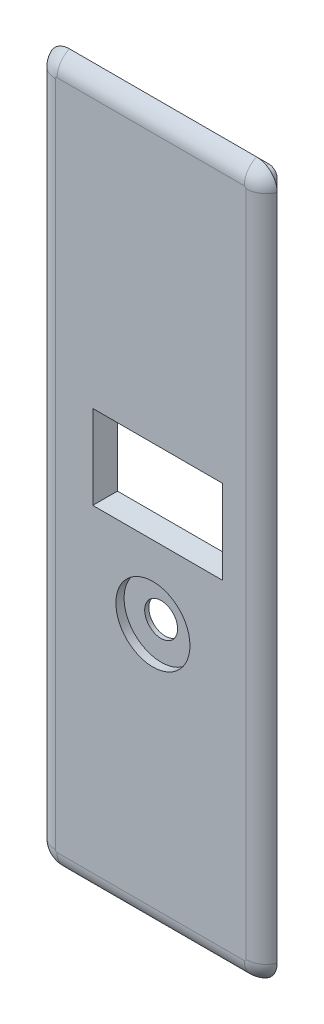
ISO-10303-21;
HEADER;
FILE_DESCRIPTION(('STEP AP214'),'2;1');
FILE_NAME('part.step','',(''),(''),'','','');
FILE_SCHEMA(('AUTOMOTIVE_DESIGN { 1 0 10303 214 1 1 1 1 }'));
ENDSEC;
DATA;
#1=APPLICATION_CONTEXT('core data for automotive mechanical design processes');
#2=APPLICATION_PROTOCOL_DEFINITION('international standard','automotive_design',2000,#1);
#3=PRODUCT_CONTEXT('',#1,'mechanical');
#4=PRODUCT('Part','Part','',(#3));
#5=PRODUCT_RELATED_PRODUCT_CATEGORY('part','',(#4));
#6=PRODUCT_DEFINITION_FORMATION('','',#4);
#7=PRODUCT_DEFINITION_CONTEXT('part definition',#1,'design');
#8=PRODUCT_DEFINITION('design','',#6,#7);
#9=PRODUCT_DEFINITION_SHAPE('','',#8);
#10=(LENGTH_UNIT() NAMED_UNIT(*) SI_UNIT(.MILLI.,.METRE.));
#11=(NAMED_UNIT(*) PLANE_ANGLE_UNIT() SI_UNIT($,.RADIAN.));
#12=(NAMED_UNIT(*) SI_UNIT($,.STERADIAN.) SOLID_ANGLE_UNIT());
#13=UNCERTAINTY_MEASURE_WITH_UNIT(LENGTH_MEASURE(1.E-05),#10,'distance_accuracy_value','');
#14=(GEOMETRIC_REPRESENTATION_CONTEXT(3) GLOBAL_UNCERTAINTY_ASSIGNED_CONTEXT((#13)) GLOBAL_UNIT_ASSIGNED_CONTEXT((#10,
#11,#12)) REPRESENTATION_CONTEXT('',''));
#15=CARTESIAN_POINT('',(0.,0.,0.));
#16=DIRECTION('',(0.,0.,1.));
#17=DIRECTION('',(1.,0.,0.));
#18=AXIS2_PLACEMENT_3D('',#15,#16,#17);
#19=CARTESIAN_POINT('',(0.548000000000118,-9.90000000000046,3.));
#20=DIRECTION('',(0.,0.,-1.));
#21=DIRECTION('',(-1.,0.,0.));
#22=AXIS2_PLACEMENT_3D('',#19,#20,#21);
#23=CYLINDRICAL_SURFACE('',#22,4.);
#24=CARTESIAN_POINT('',(0.548000000000118,-9.90000000000046,0.));
#25=DIRECTION('',(0.,0.,1.));
#26=DIRECTION('',(1.,0.,0.));
#27=AXIS2_PLACEMENT_3D('',#24,#25,#26);
#28=CIRCLE('',#27,4.);
#29=CARTESIAN_POINT('',(4.54800000000012,-9.90000000000046,0.));
#30=VERTEX_POINT('',#29);
#31=EDGE_CURVE('E216',#30,#30,#28,.T.);
#32=ORIENTED_EDGE('',*,*,#31,.F.);
#33=EDGE_LOOP('',(#32));
#34=FACE_BOUND('',#33,.T.);
#35=CARTESIAN_POINT('',(0.548000000000118,-9.90000000000046,1.));
#36=DIRECTION('',(0.,0.,1.));
#37=DIRECTION('',(1.,0.,0.));
#38=AXIS2_PLACEMENT_3D('',#35,#36,#37);
#39=CIRCLE('',#38,4.);
#40=CARTESIAN_POINT('',(4.54800000000012,-9.90000000000046,1.));
#41=VERTEX_POINT('',#40);
#42=EDGE_CURVE('E39',#41,#41,#39,.T.);
#43=ORIENTED_EDGE('',*,*,#42,.T.);
#44=EDGE_LOOP('',(#43));
#45=FACE_BOUND('',#44,.T.);
#46=ADVANCED_FACE('F35',(#34,#45),#23,.F.);
#47=CARTESIAN_POINT('',(22.74,-69.15,-3.));
#48=DIRECTION('',(0.,0.,1.));
#49=DIRECTION('',(1.,0.,0.));
#50=AXIS2_PLACEMENT_3D('',#47,#48,#49);
#51=CYLINDRICAL_SURFACE('',#50,2.);
#52=CARTESIAN_POINT('',(22.74,-69.15,0.));
#53=DIRECTION('',(0.,0.,1.));
#54=DIRECTION('',(1.,0.,0.));
#55=AXIS2_PLACEMENT_3D('',#52,#53,#54);
#56=CIRCLE('',#55,2.);
#57=CARTESIAN_POINT('',(22.74,-71.15,0.));
#58=VERTEX_POINT('',#57);
#59=CARTESIAN_POINT('',(24.74,-69.15,0.));
#60=VERTEX_POINT('',#59);
#61=EDGE_CURVE('E282',#58,#60,#56,.T.);
#62=ORIENTED_EDGE('',*,*,#61,.F.);
#63=DIRECTION('',(0.,0.,1.));
#64=VECTOR('',#63,1.);
#65=CARTESIAN_POINT('',(22.74,-71.15,-3.));
#66=LINE('',#65,#64);
#67=CARTESIAN_POINT('',(22.74,-71.15,-3.));
#68=VERTEX_POINT('',#67);
#69=EDGE_CURVE('E339',#68,#58,#66,.T.);
#70=ORIENTED_EDGE('',*,*,#69,.F.);
#71=CARTESIAN_POINT('',(22.74,-69.15,-3.));
#72=DIRECTION('',(0.,0.,1.));
#73=DIRECTION('',(1.,0.,0.));
#74=AXIS2_PLACEMENT_3D('',#71,#72,#73);
#75=CIRCLE('',#74,2.);
#76=CARTESIAN_POINT('',(24.74,-69.15,-3.));
#77=VERTEX_POINT('',#76);
#78=EDGE_CURVE('E291',#68,#77,#75,.T.);
#79=ORIENTED_EDGE('',*,*,#78,.T.);
#80=DIRECTION('',(0.,0.,1.));
#81=VECTOR('',#80,1.);
#82=CARTESIAN_POINT('',(24.74,-69.15,-3.));
#83=LINE('',#82,#81);
#84=EDGE_CURVE('E316',#77,#60,#83,.T.);
#85=ORIENTED_EDGE('',*,*,#84,.T.);
#86=EDGE_LOOP('',(#62,#70,#79,#85));
#87=FACE_BOUND('',#86,.T.);
#88=ADVANCED_FACE('F439',(#87),#51,.T.);
#89=CARTESIAN_POINT('',(-22.74,-71.15,-3.));
#90=DIRECTION('',(0.,-1.,0.));
#91=DIRECTION('',(0.,0.,-1.));
#92=AXIS2_PLACEMENT_3D('',#89,#90,#91);
#93=PLANE('',#92);
#94=DIRECTION('',(1.,0.,0.));
#95=VECTOR('',#94,1.);
#96=CARTESIAN_POINT('',(-22.74,-71.15,0.));
#97=LINE('',#96,#95);
#98=CARTESIAN_POINT('',(-22.74,-71.15,0.));
#99=VERTEX_POINT('',#98);
#100=EDGE_CURVE('E295',#99,#58,#97,.T.);
#101=ORIENTED_EDGE('',*,*,#100,.F.);
#102=DIRECTION('',(0.,0.,1.));
#103=VECTOR('',#102,1.);
#104=CARTESIAN_POINT('',(-22.74,-71.15,-3.));
#105=LINE('',#104,#103);
#106=CARTESIAN_POINT('',(-22.74,-71.15,-3.));
#107=VERTEX_POINT('',#106);
#108=EDGE_CURVE('E343',#107,#99,#105,.T.);
#109=ORIENTED_EDGE('',*,*,#108,.F.);
#110=DIRECTION('',(1.,0.,0.));
#111=VECTOR('',#110,1.);
#112=CARTESIAN_POINT('',(-22.74,-71.15,-3.));
#113=LINE('',#112,#111);
#114=EDGE_CURVE('E313',#107,#68,#113,.T.);
#115=ORIENTED_EDGE('',*,*,#114,.T.);
#116=ORIENTED_EDGE('',*,*,#69,.T.);
#117=EDGE_LOOP('',(#101,#109,#115,#116));
#118=FACE_BOUND('',#117,.T.);
#119=ADVANCED_FACE('F445',(#118),#93,.T.);
#120=CARTESIAN_POINT('',(-22.74,-69.15,-3.));
#121=DIRECTION('',(0.,0.,1.));
#122=DIRECTION('',(1.,0.,0.));
#123=AXIS2_PLACEMENT_3D('',#120,#121,#122);
#124=CYLINDRICAL_SURFACE('',#123,2.00000000000001);
#125=CARTESIAN_POINT('',(-22.74,-69.15,0.));
#126=DIRECTION('',(0.,0.,1.));
#127=DIRECTION('',(1.,0.,0.));
#128=AXIS2_PLACEMENT_3D('',#125,#126,#127);
#129=CIRCLE('',#128,2.00000000000001);
#130=CARTESIAN_POINT('',(-24.74,-69.15,0.));
#131=VERTEX_POINT('',#130);
#132=EDGE_CURVE('E334',#131,#99,#129,.T.);
#133=ORIENTED_EDGE('',*,*,#132,.F.);
#134=DIRECTION('',(0.,0.,1.));
#135=VECTOR('',#134,1.);
#136=CARTESIAN_POINT('',(-24.74,-69.15,-3.));
#137=LINE('',#136,#135);
#138=CARTESIAN_POINT('',(-24.74,-69.15,-3.));
#139=VERTEX_POINT('',#138);
#140=EDGE_CURVE('E345',#139,#131,#137,.T.);
#141=ORIENTED_EDGE('',*,*,#140,.F.);
#142=CARTESIAN_POINT('',(-22.74,-69.15,-3.));
#143=DIRECTION('',(0.,0.,1.));
#144=DIRECTION('',(1.,0.,0.));
#145=AXIS2_PLACEMENT_3D('',#142,#143,#144);
#146=CIRCLE('',#145,2.00000000000001);
#147=EDGE_CURVE('E310',#139,#107,#146,.T.);
#148=ORIENTED_EDGE('',*,*,#147,.T.);
#149=ORIENTED_EDGE('',*,*,#108,.T.);
#150=EDGE_LOOP('',(#133,#141,#148,#149));
#151=FACE_BOUND('',#150,.T.);
#152=ADVANCED_FACE('F482',(#151),#124,.T.);
#153=CARTESIAN_POINT('',(-24.74,93.04,-3.));
#154=DIRECTION('',(-1.,0.,0.));
#155=DIRECTION('',(0.,-1.,0.));
#156=AXIS2_PLACEMENT_3D('',#153,#154,#155);
#157=PLANE('',#156);
#158=DIRECTION('',(0.,-1.,0.));
#159=VECTOR('',#158,1.);
#160=CARTESIAN_POINT('',(-24.74,93.04,0.));
#161=LINE('',#160,#159);
#162=CARTESIAN_POINT('',(-24.74,93.04,0.));
#163=VERTEX_POINT('',#162);
#164=EDGE_CURVE('E331',#163,#131,#161,.T.);
#165=ORIENTED_EDGE('',*,*,#164,.F.);
#166=DIRECTION('',(0.,0.,1.));
#167=VECTOR('',#166,1.);
#168=CARTESIAN_POINT('',(-24.74,93.04,-3.));
#169=LINE('',#168,#167);
#170=CARTESIAN_POINT('',(-24.74,93.04,-3.));
#171=VERTEX_POINT('',#170);
#172=EDGE_CURVE('E347',#171,#163,#169,.T.);
#173=ORIENTED_EDGE('',*,*,#172,.F.);
#174=DIRECTION('',(0.,-1.,0.));
#175=VECTOR('',#174,1.);
#176=CARTESIAN_POINT('',(-24.74,93.04,-3.));
#177=LINE('',#176,#175);
#178=EDGE_CURVE('E307',#171,#139,#177,.T.);
#179=ORIENTED_EDGE('',*,*,#178,.T.);
#180=ORIENTED_EDGE('',*,*,#140,.T.);
#181=EDGE_LOOP('',(#165,#173,#179,#180));
#182=FACE_BOUND('',#181,.T.);
#183=ADVANCED_FACE('F486',(#182),#157,.T.);
#184=CARTESIAN_POINT('',(-22.74,93.04,-3.));
#185=DIRECTION('',(0.,0.,1.));
#186=DIRECTION('',(1.,0.,0.));
#187=AXIS2_PLACEMENT_3D('',#184,#185,#186);
#188=CYLINDRICAL_SURFACE('',#187,2.);
#189=CARTESIAN_POINT('',(-22.74,93.04,0.));
#190=DIRECTION('',(0.,0.,1.));
#191=DIRECTION('',(1.,0.,0.));
#192=AXIS2_PLACEMENT_3D('',#189,#190,#191);
#193=CIRCLE('',#192,2.);
#194=CARTESIAN_POINT('',(-22.74,95.04,0.));
#195=VERTEX_POINT('',#194);
#196=EDGE_CURVE('E328',#195,#163,#193,.T.);
#197=ORIENTED_EDGE('',*,*,#196,.F.);
#198=DIRECTION('',(0.,0.,1.));
#199=VECTOR('',#198,1.);
#200=CARTESIAN_POINT('',(-22.74,95.04,-3.));
#201=LINE('',#200,#199);
#202=CARTESIAN_POINT('',(-22.74,95.04,-3.));
#203=VERTEX_POINT('',#202);
#204=EDGE_CURVE('E349',#203,#195,#201,.T.);
#205=ORIENTED_EDGE('',*,*,#204,.F.);
#206=CARTESIAN_POINT('',(-22.74,93.04,-3.));
#207=DIRECTION('',(0.,0.,1.));
#208=DIRECTION('',(1.,0.,0.));
#209=AXIS2_PLACEMENT_3D('',#206,#207,#208);
#210=CIRCLE('',#209,2.);
#211=EDGE_CURVE('E304',#203,#171,#210,.T.);
#212=ORIENTED_EDGE('',*,*,#211,.T.);
#213=ORIENTED_EDGE('',*,*,#172,.T.);
#214=EDGE_LOOP('',(#197,#205,#212,#213));
#215=FACE_BOUND('',#214,.T.);
#216=ADVANCED_FACE('F490',(#215),#188,.T.);
#217=CARTESIAN_POINT('',(22.74,95.04,-3.));
#218=DIRECTION('',(0.,1.,0.));
#219=DIRECTION('',(0.,0.,1.));
#220=AXIS2_PLACEMENT_3D('',#217,#218,#219);
#221=PLANE('',#220);
#222=DIRECTION('',(-1.,0.,0.));
#223=VECTOR('',#222,1.);
#224=CARTESIAN_POINT('',(22.74,95.04,0.));
#225=LINE('',#224,#223);
#226=CARTESIAN_POINT('',(22.74,95.04,0.));
#227=VERTEX_POINT('',#226);
#228=EDGE_CURVE('E325',#227,#195,#225,.T.);
#229=ORIENTED_EDGE('',*,*,#228,.F.);
#230=DIRECTION('',(0.,0.,1.));
#231=VECTOR('',#230,1.);
#232=CARTESIAN_POINT('',(22.74,95.04,-3.));
#233=LINE('',#232,#231);
#234=CARTESIAN_POINT('',(22.74,95.04,-3.));
#235=VERTEX_POINT('',#234);
#236=EDGE_CURVE('E351',#235,#227,#233,.T.);
#237=ORIENTED_EDGE('',*,*,#236,.F.);
#238=DIRECTION('',(-1.,0.,0.));
#239=VECTOR('',#238,1.);
#240=CARTESIAN_POINT('',(22.74,95.04,-3.));
#241=LINE('',#240,#239);
#242=EDGE_CURVE('E301',#235,#203,#241,.T.);
#243=ORIENTED_EDGE('',*,*,#242,.T.);
#244=ORIENTED_EDGE('',*,*,#204,.T.);
#245=EDGE_LOOP('',(#229,#237,#243,#244));
#246=FACE_BOUND('',#245,.T.);
#247=ADVANCED_FACE('F494',(#246),#221,.T.);
#248=CARTESIAN_POINT('',(22.74,93.04,-3.));
#249=DIRECTION('',(0.,0.,1.));
#250=DIRECTION('',(1.,0.,0.));
#251=AXIS2_PLACEMENT_3D('',#248,#249,#250);
#252=CYLINDRICAL_SURFACE('',#251,2.);
#253=CARTESIAN_POINT('',(22.74,93.04,0.));
#254=DIRECTION('',(0.,0.,1.));
#255=DIRECTION('',(1.,0.,0.));
#256=AXIS2_PLACEMENT_3D('',#253,#254,#255);
#257=CIRCLE('',#256,2.);
#258=CARTESIAN_POINT('',(24.74,93.04,0.));
#259=VERTEX_POINT('',#258);
#260=EDGE_CURVE('E322',#259,#227,#257,.T.);
#261=ORIENTED_EDGE('',*,*,#260,.F.);
#262=DIRECTION('',(0.,0.,1.));
#263=VECTOR('',#262,1.);
#264=CARTESIAN_POINT('',(24.74,93.04,-3.));
#265=LINE('',#264,#263);
#266=CARTESIAN_POINT('',(24.74,93.04,-3.));
#267=VERTEX_POINT('',#266);
#268=EDGE_CURVE('E353',#267,#259,#265,.T.);
#269=ORIENTED_EDGE('',*,*,#268,.F.);
#270=CARTESIAN_POINT('',(22.74,93.04,-3.));
#271=DIRECTION('',(0.,0.,1.));
#272=DIRECTION('',(1.,0.,0.));
#273=AXIS2_PLACEMENT_3D('',#270,#271,#272);
#274=CIRCLE('',#273,2.);
#275=EDGE_CURVE('E298',#267,#235,#274,.T.);
#276=ORIENTED_EDGE('',*,*,#275,.T.);
#277=ORIENTED_EDGE('',*,*,#236,.T.);
#278=EDGE_LOOP('',(#261,#269,#276,#277));
#279=FACE_BOUND('',#278,.T.);
#280=ADVANCED_FACE('F498',(#279),#252,.T.);
#281=CARTESIAN_POINT('',(24.74,-69.15,-3.));
#282=DIRECTION('',(1.,0.,0.));
#283=DIRECTION('',(0.,1.,0.));
#284=AXIS2_PLACEMENT_3D('',#281,#282,#283);
#285=PLANE('',#284);
#286=DIRECTION('',(0.,1.,0.));
#287=VECTOR('',#286,1.);
#288=CARTESIAN_POINT('',(24.74,-69.15,0.));
#289=LINE('',#288,#287);
#290=EDGE_CURVE('E319',#60,#259,#289,.T.);
#291=ORIENTED_EDGE('',*,*,#290,.F.);
#292=ORIENTED_EDGE('',*,*,#84,.F.);
#293=DIRECTION('',(0.,1.,0.));
#294=VECTOR('',#293,1.);
#295=CARTESIAN_POINT('',(24.74,-69.15,-3.));
#296=LINE('',#295,#294);
#297=EDGE_CURVE('E294',#77,#267,#296,.T.);
#298=ORIENTED_EDGE('',*,*,#297,.T.);
#299=ORIENTED_EDGE('',*,*,#268,.T.);
#300=EDGE_LOOP('',(#291,#292,#298,#299));
#301=FACE_BOUND('',#300,.T.);
#302=ADVANCED_FACE('F478',(#301),#285,.T.);
#303=CARTESIAN_POINT('',(22.74,-69.15,-3.));
#304=DIRECTION('',(0.,0.,1.));
#305=DIRECTION('',(1.,0.,0.));
#306=AXIS2_PLACEMENT_3D('',#303,#304,#305);
#307=PLANE('',#306);
#308=DIRECTION('',(1.,0.,0.));
#309=VECTOR('',#308,1.);
#310=CARTESIAN_POINT('',(-21.74,-68.15,-3.));
#311=LINE('',#310,#309);
#312=CARTESIAN_POINT('',(-21.74,-68.15,-3.));
#313=VERTEX_POINT('',#312);
#314=CARTESIAN_POINT('',(21.74,-68.15,-3.));
#315=VERTEX_POINT('',#314);
#316=EDGE_CURVE('E265',#313,#315,#311,.T.);
#317=ORIENTED_EDGE('',*,*,#316,.T.);
#318=DIRECTION('',(0.,1.,0.));
#319=VECTOR('',#318,1.);
#320=CARTESIAN_POINT('',(21.74,-68.15,-3.));
#321=LINE('',#320,#319);
#322=CARTESIAN_POINT('',(21.74,92.04,-3.));
#323=VERTEX_POINT('',#322);
#324=EDGE_CURVE('E255',#315,#323,#321,.T.);
#325=ORIENTED_EDGE('',*,*,#324,.T.);
#326=DIRECTION('',(-1.,0.,0.));
#327=VECTOR('',#326,1.);
#328=CARTESIAN_POINT('',(21.74,92.04,-3.));
#329=LINE('',#328,#327);
#330=CARTESIAN_POINT('',(-21.74,92.04,-3.));
#331=VERTEX_POINT('',#330);
#332=EDGE_CURVE('E258',#323,#331,#329,.T.);
#333=ORIENTED_EDGE('',*,*,#332,.T.);
#334=DIRECTION('',(0.,-1.,0.));
#335=VECTOR('',#334,1.);
#336=CARTESIAN_POINT('',(-21.74,92.04,-3.));
#337=LINE('',#336,#335);
#338=EDGE_CURVE('E262',#331,#313,#337,.T.);
#339=ORIENTED_EDGE('',*,*,#338,.T.);
#340=EDGE_LOOP('',(#317,#325,#333,#339));
#341=FACE_BOUND('',#340,.T.);
#342=ORIENTED_EDGE('',*,*,#78,.F.);
#343=ORIENTED_EDGE('',*,*,#114,.F.);
#344=ORIENTED_EDGE('',*,*,#147,.F.);
#345=ORIENTED_EDGE('',*,*,#178,.F.);
#346=ORIENTED_EDGE('',*,*,#211,.F.);
#347=ORIENTED_EDGE('',*,*,#242,.F.);
#348=ORIENTED_EDGE('',*,*,#275,.F.);
#349=ORIENTED_EDGE('',*,*,#297,.F.);
#350=EDGE_LOOP('',(#342,#343,#344,#345,#346,#347,#348,#349));
#351=FACE_BOUND('',#350,.T.);
#352=ADVANCED_FACE('F474',(#341,#351),#307,.F.);
#353=CARTESIAN_POINT('',(21.74,-68.15,-3.));
#354=DIRECTION('',(1.,0.,0.));
#355=DIRECTION('',(0.,0.,-1.));
#356=AXIS2_PLACEMENT_3D('',#353,#354,#355);
#357=PLANE('',#356);
#358=DIRECTION('',(0.,1.,0.));
#359=VECTOR('',#358,1.);
#360=CARTESIAN_POINT('',(21.74,-68.15,0.));
#361=LINE('',#360,#359);
#362=CARTESIAN_POINT('',(21.74,-68.15,0.));
#363=VERTEX_POINT('',#362);
#364=CARTESIAN_POINT('',(21.74,92.04,0.));
#365=VERTEX_POINT('',#364);
#366=EDGE_CURVE('E254',#363,#365,#361,.T.);
#367=ORIENTED_EDGE('',*,*,#366,.T.);
#368=DIRECTION('',(0.,0.,1.));
#369=VECTOR('',#368,1.);
#370=CARTESIAN_POINT('',(21.74,92.04,-3.));
#371=LINE('',#370,#369);
#372=EDGE_CURVE('E268',#323,#365,#371,.T.);
#373=ORIENTED_EDGE('',*,*,#372,.F.);
#374=ORIENTED_EDGE('',*,*,#324,.F.);
#375=DIRECTION('',(0.,0.,1.));
#376=VECTOR('',#375,1.);
#377=CARTESIAN_POINT('',(21.74,-68.15,-3.));
#378=LINE('',#377,#376);
#379=EDGE_CURVE('E279',#315,#363,#378,.T.);
#380=ORIENTED_EDGE('',*,*,#379,.T.);
#381=EDGE_LOOP('',(#367,#373,#374,#380));
#382=FACE_BOUND('',#381,.T.);
#383=ADVANCED_FACE('F463',(#382),#357,.F.);
#384=CARTESIAN_POINT('',(-21.74,-68.15,-3.));
#385=DIRECTION('',(0.,-1.,0.));
#386=DIRECTION('',(0.,0.,-1.));
#387=AXIS2_PLACEMENT_3D('',#384,#385,#386);
#388=PLANE('',#387);
#389=DIRECTION('',(1.,0.,0.));
#390=VECTOR('',#389,1.);
#391=CARTESIAN_POINT('',(-21.74,-68.15,0.));
#392=LINE('',#391,#390);
#393=CARTESIAN_POINT('',(-21.74,-68.15,0.));
#394=VERTEX_POINT('',#393);
#395=EDGE_CURVE('E259',#394,#363,#392,.T.);
#396=ORIENTED_EDGE('',*,*,#395,.T.);
#397=ORIENTED_EDGE('',*,*,#379,.F.);
#398=ORIENTED_EDGE('',*,*,#316,.F.);
#399=DIRECTION('',(0.,0.,1.));
#400=VECTOR('',#399,1.);
#401=CARTESIAN_POINT('',(-21.74,-68.15,-3.));
#402=LINE('',#401,#400);
#403=EDGE_CURVE('E283',#313,#394,#402,.T.);
#404=ORIENTED_EDGE('',*,*,#403,.T.);
#405=EDGE_LOOP('',(#396,#397,#398,#404));
#406=FACE_BOUND('',#405,.T.);
#407=ADVANCED_FACE('F459',(#406),#388,.F.);
#408=CARTESIAN_POINT('',(-21.74,92.04,-3.));
#409=DIRECTION('',(-1.,0.,0.));
#410=DIRECTION('',(0.,-1.,0.));
#411=AXIS2_PLACEMENT_3D('',#408,#409,#410);
#412=PLANE('',#411);
#413=DIRECTION('',(0.,-1.,0.));
#414=VECTOR('',#413,1.);
#415=CARTESIAN_POINT('',(-21.74,92.04,0.));
#416=LINE('',#415,#414);
#417=CARTESIAN_POINT('',(-21.74,92.04,0.));
#418=VERTEX_POINT('',#417);
#419=EDGE_CURVE('E274',#418,#394,#416,.T.);
#420=ORIENTED_EDGE('',*,*,#419,.T.);
#421=ORIENTED_EDGE('',*,*,#403,.F.);
#422=ORIENTED_EDGE('',*,*,#338,.F.);
#423=DIRECTION('',(0.,0.,1.));
#424=VECTOR('',#423,1.);
#425=CARTESIAN_POINT('',(-21.74,92.04,-3.));
#426=LINE('',#425,#424);
#427=EDGE_CURVE('E286',#331,#418,#426,.T.);
#428=ORIENTED_EDGE('',*,*,#427,.T.);
#429=EDGE_LOOP('',(#420,#421,#422,#428));
#430=FACE_BOUND('',#429,.T.);
#431=ADVANCED_FACE('F462',(#430),#412,.F.);
#432=CARTESIAN_POINT('',(21.74,92.04,-3.));
#433=DIRECTION('',(0.,1.,0.));
#434=DIRECTION('',(-1.,0.,0.));
#435=AXIS2_PLACEMENT_3D('',#432,#433,#434);
#436=PLANE('',#435);
#437=DIRECTION('',(-1.,0.,0.));
#438=VECTOR('',#437,1.);
#439=CARTESIAN_POINT('',(21.74,92.04,0.));
#440=LINE('',#439,#438);
#441=EDGE_CURVE('E271',#365,#418,#440,.T.);
#442=ORIENTED_EDGE('',*,*,#441,.T.);
#443=ORIENTED_EDGE('',*,*,#427,.F.);
#444=ORIENTED_EDGE('',*,*,#332,.F.);
#445=ORIENTED_EDGE('',*,*,#372,.T.);
#446=EDGE_LOOP('',(#442,#443,#444,#445));
#447=FACE_BOUND('',#446,.T.);
#448=ADVANCED_FACE('F467',(#447),#436,.F.);
#449=CARTESIAN_POINT('',(-22.74,-69.15,0.));
#450=DIRECTION('',(0.,0.,1.));
#451=DIRECTION('',(1.,0.,0.));
#452=AXIS2_PLACEMENT_3D('',#449,#450,#451);
#453=PLANE('',#452);
#454=CARTESIAN_POINT('',(-22.74,-69.15,0.));
#455=DIRECTION('',(0.,0.,1.));
#456=DIRECTION('',(1.,0.,0.));
#457=AXIS2_PLACEMENT_3D('',#454,#455,#456);
#458=CIRCLE('',#457,5.);
#459=CARTESIAN_POINT('',(-27.74,-69.1499999999999,0.));
#460=VERTEX_POINT('',#459);
#461=CARTESIAN_POINT('',(-22.74,-74.15,0.));
#462=VERTEX_POINT('',#461);
#463=EDGE_CURVE('E230',#460,#462,#458,.T.);
#464=ORIENTED_EDGE('',*,*,#463,.F.);
#465=DIRECTION('',(0.,-1.,0.));
#466=VECTOR('',#465,1.);
#467=CARTESIAN_POINT('',(-27.74,93.04,0.));
#468=LINE('',#467,#466);
#469=CARTESIAN_POINT('',(-27.74,93.04,0.));
#470=VERTEX_POINT('',#469);
#471=EDGE_CURVE('E251',#470,#460,#468,.T.);
#472=ORIENTED_EDGE('',*,*,#471,.F.);
#473=CARTESIAN_POINT('',(-22.74,93.04,0.));
#474=DIRECTION('',(0.,0.,1.));
#475=DIRECTION('',(1.,0.,0.));
#476=AXIS2_PLACEMENT_3D('',#473,#474,#475);
#477=CIRCLE('',#476,5.);
#478=CARTESIAN_POINT('',(-22.74,98.04,0.));
#479=VERTEX_POINT('',#478);
#480=EDGE_CURVE('E248',#479,#470,#477,.T.);
#481=ORIENTED_EDGE('',*,*,#480,.F.);
#482=DIRECTION('',(-1.,0.,0.));
#483=VECTOR('',#482,1.);
#484=CARTESIAN_POINT('',(22.74,98.04,0.));
#485=LINE('',#484,#483);
#486=CARTESIAN_POINT('',(22.74,98.04,0.));
#487=VERTEX_POINT('',#486);
#488=EDGE_CURVE('E245',#487,#479,#485,.T.);
#489=ORIENTED_EDGE('',*,*,#488,.F.);
#490=CARTESIAN_POINT('',(22.74,93.04,0.));
#491=DIRECTION('',(0.,0.,1.));
#492=DIRECTION('',(1.,0.,0.));
#493=AXIS2_PLACEMENT_3D('',#490,#491,#492);
#494=CIRCLE('',#493,5.);
#495=CARTESIAN_POINT('',(27.74,93.04,0.));
#496=VERTEX_POINT('',#495);
#497=EDGE_CURVE('E242',#496,#487,#494,.T.);
#498=ORIENTED_EDGE('',*,*,#497,.F.);
#499=DIRECTION('',(0.,1.,0.));
#500=VECTOR('',#499,1.);
#501=CARTESIAN_POINT('',(27.74,-69.15,0.));
#502=LINE('',#501,#500);
#503=CARTESIAN_POINT('',(27.74,-69.15,0.));
#504=VERTEX_POINT('',#503);
#505=EDGE_CURVE('E239',#504,#496,#502,.T.);
#506=ORIENTED_EDGE('',*,*,#505,.F.);
#507=CARTESIAN_POINT('',(22.74,-69.15,0.));
#508=DIRECTION('',(0.,0.,1.));
#509=DIRECTION('',(1.,0.,0.));
#510=AXIS2_PLACEMENT_3D('',#507,#508,#509);
#511=CIRCLE('',#510,5.);
#512=CARTESIAN_POINT('',(22.74,-74.15,0.));
#513=VERTEX_POINT('',#512);
#514=EDGE_CURVE('E236',#513,#504,#511,.T.);
#515=ORIENTED_EDGE('',*,*,#514,.F.);
#516=DIRECTION('',(1.,0.,0.));
#517=VECTOR('',#516,1.);
#518=CARTESIAN_POINT('',(-22.74,-74.15,0.));
#519=LINE('',#518,#517);
#520=EDGE_CURVE('E233',#462,#513,#519,.T.);
#521=ORIENTED_EDGE('',*,*,#520,.F.);
#522=EDGE_LOOP('',(#464,#472,#481,#489,#498,#506,#515,#521));
#523=FACE_BOUND('',#522,.T.);
#524=ORIENTED_EDGE('',*,*,#100,.T.);
#525=ORIENTED_EDGE('',*,*,#61,.T.);
#526=ORIENTED_EDGE('',*,*,#290,.T.);
#527=ORIENTED_EDGE('',*,*,#260,.T.);
#528=ORIENTED_EDGE('',*,*,#228,.T.);
#529=ORIENTED_EDGE('',*,*,#196,.T.);
#530=ORIENTED_EDGE('',*,*,#164,.T.);
#531=ORIENTED_EDGE('',*,*,#132,.T.);
#532=EDGE_LOOP('',(#524,#525,#526,#527,#528,#529,#530,#531));
#533=FACE_BOUND('',#532,.T.);
#534=ADVANCED_FACE('F407',(#523,#533),#453,.F.);
#535=CARTESIAN_POINT('',(-22.74,-69.15,3.));
#536=DIRECTION('',(0.,0.,1.));
#537=DIRECTION('',(1.,0.,0.));
#538=AXIS2_PLACEMENT_3D('',#535,#536,#537);
#539=PLANE('',#538);
#540=CARTESIAN_POINT('',(0.548,-9.9,3.));
#541=DIRECTION('',(0.,0.,1.));
#542=DIRECTION('',(1.,0.,0.));
#543=AXIS2_PLACEMENT_3D('',#540,#541,#542);
#544=CIRCLE('',#543,9.);
#545=CARTESIAN_POINT('',(9.548,-9.9,3.));
#546=VERTEX_POINT('',#545);
#547=EDGE_CURVE('E534',#546,#546,#544,.T.);
#548=ORIENTED_EDGE('',*,*,#547,.F.);
#549=EDGE_LOOP('',(#548));
#550=FACE_BOUND('',#549,.T.);
#551=CARTESIAN_POINT('',(-22.74,93.04,3.));
#552=DIRECTION('',(0.,0.,1.));
#553=DIRECTION('',(1.,0.,0.));
#554=AXIS2_PLACEMENT_3D('',#551,#552,#553);
#555=CIRCLE('',#554,0.417424305044165);
#556=CARTESIAN_POINT('',(-22.74,93.4574243050442,3.));
#557=VERTEX_POINT('',#556);
#558=CARTESIAN_POINT('',(-23.1574243050442,93.04,3.));
#559=VERTEX_POINT('',#558);
#560=EDGE_CURVE('E44',#557,#559,#555,.T.);
#561=ORIENTED_EDGE('',*,*,#560,.T.);
#562=DIRECTION('',(0.,1.,0.));
#563=VECTOR('',#562,1.);
#564=CARTESIAN_POINT('',(-23.1574243050442,-69.1499999999999,3.));
#565=LINE('',#564,#563);
#566=CARTESIAN_POINT('',(-23.1574243050442,-69.15,3.));
#567=VERTEX_POINT('',#566);
#568=EDGE_CURVE('E11',#559,#567,#565,.F.);
#569=ORIENTED_EDGE('',*,*,#568,.T.);
#570=CARTESIAN_POINT('',(-22.74,-69.15,3.));
#571=DIRECTION('',(0.,0.,1.));
#572=DIRECTION('',(1.,0.,0.));
#573=AXIS2_PLACEMENT_3D('',#570,#571,#572);
#574=CIRCLE('',#573,0.417424305044161);
#575=CARTESIAN_POINT('',(-22.74,-69.5674243050442,3.));
#576=VERTEX_POINT('',#575);
#577=EDGE_CURVE('E361',#567,#576,#574,.T.);
#578=ORIENTED_EDGE('',*,*,#577,.T.);
#579=DIRECTION('',(-1.,0.,0.));
#580=VECTOR('',#579,1.);
#581=CARTESIAN_POINT('',(22.74,-69.5674243050442,3.));
#582=LINE('',#581,#580);
#583=CARTESIAN_POINT('',(22.74,-69.5674243050442,3.));
#584=VERTEX_POINT('',#583);
#585=EDGE_CURVE('E369',#576,#584,#582,.F.);
#586=ORIENTED_EDGE('',*,*,#585,.T.);
#587=CARTESIAN_POINT('',(22.74,-69.15,3.));
#588=DIRECTION('',(0.,0.,1.));
#589=DIRECTION('',(1.,0.,0.));
#590=AXIS2_PLACEMENT_3D('',#587,#588,#589);
#591=CIRCLE('',#590,0.417424305044161);
#592=CARTESIAN_POINT('',(23.1574243050441,-69.15,3.));
#593=VERTEX_POINT('',#592);
#594=EDGE_CURVE('E371',#584,#593,#591,.T.);
#595=ORIENTED_EDGE('',*,*,#594,.T.);
#596=DIRECTION('',(0.,-1.,0.));
#597=VECTOR('',#596,1.);
#598=CARTESIAN_POINT('',(23.1574243050442,93.04,3.));
#599=LINE('',#598,#597);
#600=CARTESIAN_POINT('',(23.1574243050442,93.04,3.));
#601=VERTEX_POINT('',#600);
#602=EDGE_CURVE('E373',#593,#601,#599,.F.);
#603=ORIENTED_EDGE('',*,*,#602,.T.);
#604=CARTESIAN_POINT('',(22.74,93.04,3.));
#605=DIRECTION('',(0.,0.,1.));
#606=DIRECTION('',(1.,0.,0.));
#607=AXIS2_PLACEMENT_3D('',#604,#605,#606);
#608=CIRCLE('',#607,0.417424305044161);
#609=CARTESIAN_POINT('',(22.74,93.4574243050442,3.));
#610=VERTEX_POINT('',#609);
#611=EDGE_CURVE('E375',#601,#610,#608,.T.);
#612=ORIENTED_EDGE('',*,*,#611,.T.);
#613=DIRECTION('',(1.,0.,0.));
#614=VECTOR('',#613,1.);
#615=CARTESIAN_POINT('',(-22.74,93.4574243050442,3.));
#616=LINE('',#615,#614);
#617=EDGE_CURVE('E55',#610,#557,#616,.F.);
#618=ORIENTED_EDGE('',*,*,#617,.T.);
#619=EDGE_LOOP('',(#561,#569,#578,#586,#595,#603,#612,#618));
#620=FACE_BOUND('',#619,.T.);
#621=DIRECTION('',(1.,0.,0.));
#622=VECTOR('',#621,1.);
#623=CARTESIAN_POINT('',(14.44039062757,28.208987034036,3.));
#624=LINE('',#623,#622);
#625=CARTESIAN_POINT('',(-14.05960937243,28.208987034036,3.));
#626=VERTEX_POINT('',#625);
#627=CARTESIAN_POINT('',(17.44039062757,28.208987034036,3.));
#628=VERTEX_POINT('',#627);
#629=EDGE_CURVE('E342',#626,#628,#624,.T.);
#630=ORIENTED_EDGE('',*,*,#629,.T.);
#631=DIRECTION('',(0.,-1.,0.));
#632=VECTOR('',#631,1.);
#633=CARTESIAN_POINT('',(17.44039062757,10.808987034036,3.));
#634=LINE('',#633,#632);
#635=CARTESIAN_POINT('',(17.44039062757,7.808987034036,3.));
#636=VERTEX_POINT('',#635);
#637=EDGE_CURVE('E203',#628,#636,#634,.T.);
#638=ORIENTED_EDGE('',*,*,#637,.T.);
#639=DIRECTION('',(-1.,0.,0.));
#640=VECTOR('',#639,1.);
#641=CARTESIAN_POINT('',(-11.05960937243,7.808987034036,3.));
#642=LINE('',#641,#640);
#643=CARTESIAN_POINT('',(-14.05960937243,7.808987034036,3.));
#644=VERTEX_POINT('',#643);
#645=EDGE_CURVE('E359',#636,#644,#642,.T.);
#646=ORIENTED_EDGE('',*,*,#645,.T.);
#647=DIRECTION('',(0.,1.,0.));
#648=VECTOR('',#647,1.);
#649=CARTESIAN_POINT('',(-14.05960937243,25.208987034036,3.));
#650=LINE('',#649,#648);
#651=EDGE_CURVE('E357',#644,#626,#650,.T.);
#652=ORIENTED_EDGE('',*,*,#651,.T.);
#653=EDGE_LOOP('',(#630,#638,#646,#652));
#654=FACE_BOUND('',#653,.T.);
#655=ADVANCED_FACE('F420',(#550,#620,#654),#539,.T.);
#656=DIRECTION('',(-1.,0.,0.));
#657=VECTOR('',#656,1.);
#658=CARTESIAN_POINT('',(14.44039062757,10.808987034036,0.));
#659=LINE('',#658,#657);
#660=CARTESIAN_POINT('',(14.44039062757,10.808987034036,0.));
#661=VERTEX_POINT('',#660);
#662=CARTESIAN_POINT('',(-11.05960937243,10.808987034036,0.));
#663=VERTEX_POINT('',#662);
#664=EDGE_CURVE('E221',#661,#663,#659,.T.);
#665=ORIENTED_EDGE('',*,*,#664,.F.);
#666=DIRECTION('',(0.,-1.,0.));
#667=VECTOR('',#666,1.);
#668=CARTESIAN_POINT('',(14.44039062757,25.208987034036,0.));
#669=LINE('',#668,#667);
#670=CARTESIAN_POINT('',(14.44039062757,25.208987034036,0.));
#671=VERTEX_POINT('',#670);
#672=EDGE_CURVE('E201',#671,#661,#669,.T.);
#673=ORIENTED_EDGE('',*,*,#672,.F.);
#674=DIRECTION('',(1.,0.,0.));
#675=VECTOR('',#674,1.);
#676=CARTESIAN_POINT('',(14.44039062757,25.208987034036,0.));
#677=LINE('',#676,#675);
#678=CARTESIAN_POINT('',(-11.05960937243,25.208987034036,0.));
#679=VERTEX_POINT('',#678);
#680=EDGE_CURVE('E210',#679,#671,#677,.T.);
#681=ORIENTED_EDGE('',*,*,#680,.F.);
#682=DIRECTION('',(0.,1.,0.));
#683=VECTOR('',#682,1.);
#684=CARTESIAN_POINT('',(-11.05960937243,25.208987034036,0.));
#685=LINE('',#684,#683);
#686=EDGE_CURVE('E224',#663,#679,#685,.T.);
#687=ORIENTED_EDGE('',*,*,#686,.F.);
#688=EDGE_LOOP('',(#665,#673,#681,#687));
#689=FACE_BOUND('',#688,.T.);
#690=ORIENTED_EDGE('',*,*,#366,.F.);
#691=ORIENTED_EDGE('',*,*,#395,.F.);
#692=ORIENTED_EDGE('',*,*,#419,.F.);
#693=ORIENTED_EDGE('',*,*,#441,.F.);
#694=EDGE_LOOP('',(#690,#691,#692,#693));
#695=FACE_BOUND('',#694,.T.);
#696=ORIENTED_EDGE('',*,*,#31,.T.);
#697=EDGE_LOOP('',(#696));
#698=FACE_BOUND('',#697,.T.);
#699=ADVANCED_FACE('F218',(#689,#695,#698),#453,.F.);
#700=CARTESIAN_POINT('',(-11.05960937243,25.208987034036,0.));
#701=DIRECTION('',(0.707106781186547,0.,0.707106781186547));
#702=DIRECTION('',(0.,1.,0.));
#703=AXIS2_PLACEMENT_3D('',#700,#701,#702);
#704=PLANE('',#703);
#705=DIRECTION('',(0.577350269189626,-0.577350269189625,-0.577350269189626));
#706=VECTOR('',#705,1.);
#707=CARTESIAN_POINT('',(-11.05960937243,25.208987034036,0.));
#708=LINE('',#707,#706);
#709=EDGE_CURVE('E213',#626,#679,#708,.T.);
#710=ORIENTED_EDGE('',*,*,#709,.F.);
#711=ORIENTED_EDGE('',*,*,#651,.F.);
#712=DIRECTION('',(0.577350269189626,0.577350269189626,-0.577350269189626));
#713=VECTOR('',#712,1.);
#714=CARTESIAN_POINT('',(-2.55960937243,19.308987034036,-8.50000000000001));
#715=LINE('',#714,#713);
#716=EDGE_CURVE('E365',#663,#644,#715,.F.);
#717=ORIENTED_EDGE('',*,*,#716,.F.);
#718=ORIENTED_EDGE('',*,*,#686,.T.);
#719=EDGE_LOOP('',(#710,#711,#717,#718));
#720=FACE_BOUND('',#719,.T.);
#721=ADVANCED_FACE('F458',(#720),#704,.T.);
#722=CARTESIAN_POINT('',(14.44039062757,10.808987034036,0.));
#723=DIRECTION('',(0.,0.707106781186548,0.707106781186547));
#724=DIRECTION('',(-1.,0.,0.));
#725=AXIS2_PLACEMENT_3D('',#722,#723,#724);
#726=PLANE('',#725);
#727=ORIENTED_EDGE('',*,*,#716,.T.);
#728=ORIENTED_EDGE('',*,*,#645,.F.);
#729=DIRECTION('',(-0.577350269189626,0.577350269189626,-0.577350269189626));
#730=VECTOR('',#729,1.);
#731=CARTESIAN_POINT('',(9.64039062757,15.608987034036,-4.80000000000001));
#732=LINE('',#731,#730);
#733=EDGE_CURVE('E206',#661,#636,#732,.F.);
#734=ORIENTED_EDGE('',*,*,#733,.F.);
#735=ORIENTED_EDGE('',*,*,#664,.T.);
#736=EDGE_LOOP('',(#727,#728,#734,#735));
#737=FACE_BOUND('',#736,.T.);
#738=ADVANCED_FACE('F517',(#737),#726,.T.);
#739=CARTESIAN_POINT('',(14.44039062757,25.208987034036,0.));
#740=DIRECTION('',(0.,-0.707106781186548,0.707106781186547));
#741=DIRECTION('',(1.,0.,0.));
#742=AXIS2_PLACEMENT_3D('',#739,#740,#741);
#743=PLANE('',#742);
#744=ORIENTED_EDGE('',*,*,#709,.T.);
#745=ORIENTED_EDGE('',*,*,#680,.T.);
#746=DIRECTION('',(0.577350269189626,0.577350269189626,0.577350269189626));
#747=VECTOR('',#746,1.);
#748=CARTESIAN_POINT('',(14.44039062757,25.208987034036,0.));
#749=LINE('',#748,#747);
#750=EDGE_CURVE('E197',#628,#671,#749,.F.);
#751=ORIENTED_EDGE('',*,*,#750,.F.);
#752=ORIENTED_EDGE('',*,*,#629,.F.);
#753=EDGE_LOOP('',(#744,#745,#751,#752));
#754=FACE_BOUND('',#753,.T.);
#755=ADVANCED_FACE('F211',(#754),#743,.T.);
#756=CARTESIAN_POINT('',(14.44039062757,25.208987034036,0.));
#757=DIRECTION('',(-0.707106781186548,0.,0.707106781186547));
#758=DIRECTION('',(0.,-1.,0.));
#759=AXIS2_PLACEMENT_3D('',#756,#757,#758);
#760=PLANE('',#759);
#761=ORIENTED_EDGE('',*,*,#733,.T.);
#762=ORIENTED_EDGE('',*,*,#637,.F.);
#763=ORIENTED_EDGE('',*,*,#750,.T.);
#764=ORIENTED_EDGE('',*,*,#672,.T.);
#765=EDGE_LOOP('',(#761,#762,#763,#764));
#766=FACE_BOUND('',#765,.T.);
#767=ADVANCED_FACE('F199',(#766),#760,.T.);
#768=CARTESIAN_POINT('',(23.1574243050441,-69.15,-2.));
#769=DIRECTION('',(0.,1.,0.));
#770=DIRECTION('',(-1.,0.,0.));
#771=AXIS2_PLACEMENT_3D('',#768,#769,#770);
#772=CYLINDRICAL_SURFACE('',#771,5.);
#773=CARTESIAN_POINT('',(23.1574243050441,-69.15,-2.));
#774=DIRECTION('',(0.,-1.,0.));
#775=DIRECTION('',(0.,0.,-1.));
#776=AXIS2_PLACEMENT_3D('',#773,#774,#775);
#777=CIRCLE('',#776,5.);
#778=EDGE_CURVE('E395',#504,#593,#777,.T.);
#779=ORIENTED_EDGE('',*,*,#778,.F.);
#780=ORIENTED_EDGE('',*,*,#505,.T.);
#781=CARTESIAN_POINT('',(23.1574243050442,93.04,-2.));
#782=DIRECTION('',(0.,1.,0.));
#783=DIRECTION('',(0.,0.,1.));
#784=AXIS2_PLACEMENT_3D('',#781,#782,#783);
#785=CIRCLE('',#784,5.);
#786=EDGE_CURVE('E207',#601,#496,#785,.T.);
#787=ORIENTED_EDGE('',*,*,#786,.F.);
#788=ORIENTED_EDGE('',*,*,#602,.F.);
#789=EDGE_LOOP('',(#779,#780,#787,#788));
#790=FACE_BOUND('',#789,.T.);
#791=ADVANCED_FACE('F37',(#790),#772,.T.);
#792=CARTESIAN_POINT('',(22.74,93.04,-2.));
#793=DIRECTION('',(0.,0.,-1.));
#794=DIRECTION('',(-1.,0.,0.));
#795=AXIS2_PLACEMENT_3D('',#792,#793,#794);
#796=DEGENERATE_TOROIDAL_SURFACE('',#795,0.417424305044161,5.,.T.);
#797=ORIENTED_EDGE('',*,*,#786,.T.);
#798=ORIENTED_EDGE('',*,*,#497,.T.);
#799=CARTESIAN_POINT('',(22.74,93.4574243050442,-2.));
#800=DIRECTION('',(-1.,0.,0.));
#801=DIRECTION('',(0.,0.,1.));
#802=AXIS2_PLACEMENT_3D('',#799,#800,#801);
#803=CIRCLE('',#802,5.);
#804=EDGE_CURVE('E392',#610,#487,#803,.T.);
#805=ORIENTED_EDGE('',*,*,#804,.F.);
#806=ORIENTED_EDGE('',*,*,#611,.F.);
#807=EDGE_LOOP('',(#797,#798,#805,#806));
#808=FACE_BOUND('',#807,.T.);
#809=ADVANCED_FACE('F401',(#808),#796,.T.);
#810=CARTESIAN_POINT('',(22.74,-69.15,-2.));
#811=DIRECTION('',(0.,0.,-1.));
#812=DIRECTION('',(-1.,0.,0.));
#813=AXIS2_PLACEMENT_3D('',#810,#811,#812);
#814=DEGENERATE_TOROIDAL_SURFACE('',#813,0.417424305044161,5.,.T.);
#815=ORIENTED_EDGE('',*,*,#778,.T.);
#816=ORIENTED_EDGE('',*,*,#594,.F.);
#817=CARTESIAN_POINT('',(22.74,-69.5674243050442,-2.));
#818=DIRECTION('',(-1.,0.,0.));
#819=DIRECTION('',(0.,-1.,0.));
#820=AXIS2_PLACEMENT_3D('',#817,#818,#819);
#821=CIRCLE('',#820,5.);
#822=EDGE_CURVE('E389',#513,#584,#821,.T.);
#823=ORIENTED_EDGE('',*,*,#822,.F.);
#824=ORIENTED_EDGE('',*,*,#514,.T.);
#825=EDGE_LOOP('',(#815,#816,#823,#824));
#826=FACE_BOUND('',#825,.T.);
#827=ADVANCED_FACE('F626',(#826),#814,.T.);
#828=CARTESIAN_POINT('',(22.74,93.4574243050442,-2.));
#829=DIRECTION('',(-1.,0.,0.));
#830=DIRECTION('',(0.,0.,1.));
#831=AXIS2_PLACEMENT_3D('',#828,#829,#830);
#832=CYLINDRICAL_SURFACE('',#831,5.);
#833=ORIENTED_EDGE('',*,*,#804,.T.);
#834=ORIENTED_EDGE('',*,*,#488,.T.);
#835=CARTESIAN_POINT('',(-22.74,93.4574243050442,-2.));
#836=DIRECTION('',(-1.,0.,0.));
#837=DIRECTION('',(0.,0.,1.));
#838=AXIS2_PLACEMENT_3D('',#835,#836,#837);
#839=CIRCLE('',#838,5.);
#840=EDGE_CURVE('E386',#557,#479,#839,.T.);
#841=ORIENTED_EDGE('',*,*,#840,.F.);
#842=ORIENTED_EDGE('',*,*,#617,.F.);
#843=EDGE_LOOP('',(#833,#834,#841,#842));
#844=FACE_BOUND('',#843,.T.);
#845=ADVANCED_FACE('F412',(#844),#832,.T.);
#846=CARTESIAN_POINT('',(-22.74,-69.5674243050442,-2.));
#847=DIRECTION('',(1.,0.,0.));
#848=DIRECTION('',(0.,0.,-1.));
#849=AXIS2_PLACEMENT_3D('',#846,#847,#848);
#850=CYLINDRICAL_SURFACE('',#849,5.);
#851=ORIENTED_EDGE('',*,*,#822,.T.);
#852=ORIENTED_EDGE('',*,*,#585,.F.);
#853=CARTESIAN_POINT('',(-22.74,-69.5674243050442,-2.));
#854=DIRECTION('',(-1.,0.,0.));
#855=DIRECTION('',(0.,0.,1.));
#856=AXIS2_PLACEMENT_3D('',#853,#854,#855);
#857=CIRCLE('',#856,5.);
#858=EDGE_CURVE('E383',#462,#576,#857,.T.);
#859=ORIENTED_EDGE('',*,*,#858,.F.);
#860=ORIENTED_EDGE('',*,*,#520,.T.);
#861=EDGE_LOOP('',(#851,#852,#859,#860));
#862=FACE_BOUND('',#861,.T.);
#863=ADVANCED_FACE('F427',(#862),#850,.T.);
#864=CARTESIAN_POINT('',(-22.74,93.04,-2.));
#865=DIRECTION('',(0.,0.,-1.));
#866=DIRECTION('',(-1.,0.,0.));
#867=AXIS2_PLACEMENT_3D('',#864,#865,#866);
#868=DEGENERATE_TOROIDAL_SURFACE('',#867,0.417424305044165,5.,.T.);
#869=ORIENTED_EDGE('',*,*,#840,.T.);
#870=ORIENTED_EDGE('',*,*,#480,.T.);
#871=CARTESIAN_POINT('',(-23.1574243050442,93.04,-2.));
#872=DIRECTION('',(0.,-1.,0.));
#873=DIRECTION('',(0.,0.,-1.));
#874=AXIS2_PLACEMENT_3D('',#871,#872,#873);
#875=CIRCLE('',#874,5.);
#876=EDGE_CURVE('E381',#559,#470,#875,.T.);
#877=ORIENTED_EDGE('',*,*,#876,.F.);
#878=ORIENTED_EDGE('',*,*,#560,.F.);
#879=EDGE_LOOP('',(#869,#870,#877,#878));
#880=FACE_BOUND('',#879,.T.);
#881=ADVANCED_FACE('F414',(#880),#868,.T.);
#882=CARTESIAN_POINT('',(-22.74,-69.15,-2.));
#883=DIRECTION('',(0.,0.,-1.));
#884=DIRECTION('',(-1.,0.,0.));
#885=AXIS2_PLACEMENT_3D('',#882,#883,#884);
#886=DEGENERATE_TOROIDAL_SURFACE('',#885,0.417424305044161,5.,.T.);
#887=ORIENTED_EDGE('',*,*,#858,.T.);
#888=ORIENTED_EDGE('',*,*,#577,.F.);
#889=CARTESIAN_POINT('',(-23.1574243050442,-69.15,-2.));
#890=DIRECTION('',(0.,1.,0.));
#891=DIRECTION('',(-1.,0.,0.));
#892=AXIS2_PLACEMENT_3D('',#889,#890,#891);
#893=CIRCLE('',#892,5.);
#894=EDGE_CURVE('E379',#460,#567,#893,.T.);
#895=ORIENTED_EDGE('',*,*,#894,.F.);
#896=ORIENTED_EDGE('',*,*,#463,.T.);
#897=EDGE_LOOP('',(#887,#888,#895,#896));
#898=FACE_BOUND('',#897,.T.);
#899=ADVANCED_FACE('F428',(#898),#886,.T.);
#900=CARTESIAN_POINT('',(-23.1574243050442,93.04,-2.));
#901=DIRECTION('',(0.,-1.,0.));
#902=DIRECTION('',(1.,0.,0.));
#903=AXIS2_PLACEMENT_3D('',#900,#901,#902);
#904=CYLINDRICAL_SURFACE('',#903,5.);
#905=ORIENTED_EDGE('',*,*,#876,.T.);
#906=ORIENTED_EDGE('',*,*,#471,.T.);
#907=ORIENTED_EDGE('',*,*,#894,.T.);
#908=ORIENTED_EDGE('',*,*,#568,.F.);
#909=EDGE_LOOP('',(#905,#906,#907,#908));
#910=FACE_BOUND('',#909,.T.);
#911=ADVANCED_FACE('F417',(#910),#904,.T.);
#912=CARTESIAN_POINT('',(0.548,-9.9,1.));
#913=DIRECTION('',(0.,0.,1.));
#914=DIRECTION('',(1.,0.,0.));
#915=AXIS2_PLACEMENT_3D('',#912,#913,#914);
#916=CYLINDRICAL_SURFACE('',#915,9.);
#917=CARTESIAN_POINT('',(0.548,-9.9,1.));
#918=DIRECTION('',(0.,0.,1.));
#919=DIRECTION('',(1.,0.,0.));
#920=AXIS2_PLACEMENT_3D('',#917,#918,#919);
#921=CIRCLE('',#920,9.);
#922=CARTESIAN_POINT('',(9.548,-9.9,1.));
#923=VERTEX_POINT('',#922);
#924=EDGE_CURVE('E537',#923,#923,#921,.T.);
#925=ORIENTED_EDGE('',*,*,#924,.F.);
#926=EDGE_LOOP('',(#925));
#927=FACE_BOUND('',#926,.T.);
#928=ORIENTED_EDGE('',*,*,#547,.T.);
#929=EDGE_LOOP('',(#928));
#930=FACE_BOUND('',#929,.T.);
#931=ADVANCED_FACE('F435',(#927,#930),#916,.F.);
#932=CARTESIAN_POINT('',(0.548,-9.9,1.));
#933=DIRECTION('',(0.,0.,1.));
#934=DIRECTION('',(1.,0.,0.));
#935=AXIS2_PLACEMENT_3D('',#932,#933,#934);
#936=PLANE('',#935);
#937=ORIENTED_EDGE('',*,*,#42,.F.);
#938=EDGE_LOOP('',(#937));
#939=FACE_BOUND('',#938,.T.);
#940=ORIENTED_EDGE('',*,*,#924,.T.);
#941=EDGE_LOOP('',(#940));
#942=FACE_BOUND('',#941,.T.);
#943=ADVANCED_FACE('F544',(#939,#942),#936,.T.);
#944=CLOSED_SHELL('',(#46,#88,#119,#152,#183,#216,#247,#280,#302,#352,#383,#407,#431,#448,#534,
#655,#699,#721,#738,#755,#767,#791,#809,#827,#845,#863,#881,#899,#911,#931,#943));
#945=MANIFOLD_SOLID_BREP('B2',#944);
#946=ADVANCED_BREP_SHAPE_REPRESENTATION('',(#18,#945),#14);
#947=SHAPE_DEFINITION_REPRESENTATION(#9,#946);
ENDSEC;
END-ISO-10303-21;
